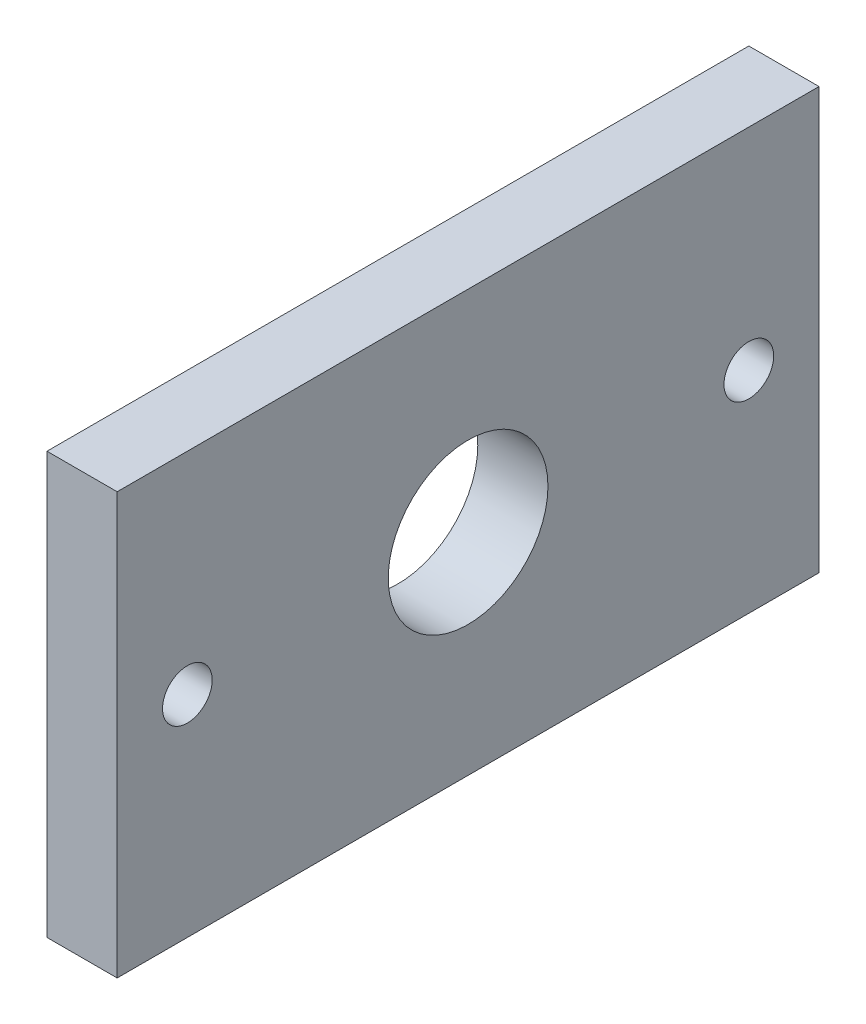
ISO-10303-21;
HEADER;
FILE_DESCRIPTION(('STEP AP214'),'2;1');
FILE_NAME('part.step','',(''),(''),'','','');
FILE_SCHEMA(('AUTOMOTIVE_DESIGN { 1 0 10303 214 1 1 1 1 }'));
ENDSEC;
DATA;
#1=APPLICATION_CONTEXT('core data for automotive mechanical design processes');
#2=APPLICATION_PROTOCOL_DEFINITION('international standard','automotive_design',2000,#1);
#3=PRODUCT_CONTEXT('',#1,'mechanical');
#4=PRODUCT('Part','Part','',(#3));
#5=PRODUCT_RELATED_PRODUCT_CATEGORY('part','',(#4));
#6=PRODUCT_DEFINITION_FORMATION('','',#4);
#7=PRODUCT_DEFINITION_CONTEXT('part definition',#1,'design');
#8=PRODUCT_DEFINITION('design','',#6,#7);
#9=PRODUCT_DEFINITION_SHAPE('','',#8);
#10=(LENGTH_UNIT() NAMED_UNIT(*) SI_UNIT(.MILLI.,.METRE.));
#11=(NAMED_UNIT(*) PLANE_ANGLE_UNIT() SI_UNIT($,.RADIAN.));
#12=(NAMED_UNIT(*) SI_UNIT($,.STERADIAN.) SOLID_ANGLE_UNIT());
#13=UNCERTAINTY_MEASURE_WITH_UNIT(LENGTH_MEASURE(1.E-05),#10,'distance_accuracy_value','');
#14=(GEOMETRIC_REPRESENTATION_CONTEXT(3) GLOBAL_UNCERTAINTY_ASSIGNED_CONTEXT((#13)) GLOBAL_UNIT_ASSIGNED_CONTEXT((#10,
#11,#12)) REPRESENTATION_CONTEXT('',''));
#15=CARTESIAN_POINT('',(0.,0.,0.));
#16=DIRECTION('',(0.,0.,1.));
#17=DIRECTION('',(1.,0.,0.));
#18=AXIS2_PLACEMENT_3D('',#15,#16,#17);
#19=CARTESIAN_POINT('',(6.35,0.,0.));
#20=DIRECTION('',(-1.,0.,0.));
#21=DIRECTION('',(0.,0.,1.));
#22=AXIS2_PLACEMENT_3D('',#19,#20,#21);
#23=PLANE('',#22);
#24=CARTESIAN_POINT('',(6.35,0.,25.4));
#25=DIRECTION('',(1.,0.,0.));
#26=DIRECTION('',(0.,0.,-1.));
#27=AXIS2_PLACEMENT_3D('',#24,#25,#26);
#28=CIRCLE('',#27,2.2479);
#29=CARTESIAN_POINT('',(6.35,0.,23.1521));
#30=VERTEX_POINT('',#29);
#31=EDGE_CURVE('E127',#30,#30,#28,.T.);
#32=ORIENTED_EDGE('',*,*,#31,.F.);
#33=EDGE_LOOP('',(#32));
#34=FACE_BOUND('',#33,.T.);
#35=DIRECTION('',(0.,1.,0.));
#36=VECTOR('',#35,1.);
#37=CARTESIAN_POINT('',(6.35,-19.05,-31.75));
#38=LINE('',#37,#36);
#39=CARTESIAN_POINT('',(6.35,-19.05,-31.75));
#40=VERTEX_POINT('',#39);
#41=CARTESIAN_POINT('',(6.35,19.05,-31.75));
#42=VERTEX_POINT('',#41);
#43=EDGE_CURVE('E97',#40,#42,#38,.T.);
#44=ORIENTED_EDGE('',*,*,#43,.T.);
#45=DIRECTION('',(0.,0.,1.));
#46=VECTOR('',#45,1.);
#47=CARTESIAN_POINT('',(6.35,19.05,31.75));
#48=LINE('',#47,#46);
#49=CARTESIAN_POINT('',(6.35,19.05,31.75));
#50=VERTEX_POINT('',#49);
#51=EDGE_CURVE('E92',#42,#50,#48,.T.);
#52=ORIENTED_EDGE('',*,*,#51,.T.);
#53=DIRECTION('',(0.,-1.,0.));
#54=VECTOR('',#53,1.);
#55=CARTESIAN_POINT('',(6.35,-19.05,31.75));
#56=LINE('',#55,#54);
#57=CARTESIAN_POINT('',(6.35,-19.05,31.75));
#58=VERTEX_POINT('',#57);
#59=EDGE_CURVE('E95',#50,#58,#56,.T.);
#60=ORIENTED_EDGE('',*,*,#59,.T.);
#61=DIRECTION('',(0.,0.,-1.));
#62=VECTOR('',#61,1.);
#63=CARTESIAN_POINT('',(6.35,-19.05,31.75));
#64=LINE('',#63,#62);
#65=EDGE_CURVE('E62',#58,#40,#64,.T.);
#66=ORIENTED_EDGE('',*,*,#65,.T.);
#67=EDGE_LOOP('',(#44,#52,#60,#66));
#68=FACE_BOUND('',#67,.T.);
#69=CARTESIAN_POINT('',(6.35,0.,0.));
#70=DIRECTION('',(1.,0.,0.));
#71=DIRECTION('',(0.,0.,-1.));
#72=AXIS2_PLACEMENT_3D('',#69,#70,#71);
#73=CIRCLE('',#72,7.2263);
#74=CARTESIAN_POINT('',(6.35,0.,-7.2263));
#75=VERTEX_POINT('',#74);
#76=EDGE_CURVE('E112',#75,#75,#73,.T.);
#77=ORIENTED_EDGE('',*,*,#76,.F.);
#78=EDGE_LOOP('',(#77));
#79=FACE_BOUND('',#78,.T.);
#80=CARTESIAN_POINT('',(6.35,0.,-25.4));
#81=DIRECTION('',(1.,0.,0.));
#82=DIRECTION('',(0.,0.,1.));
#83=AXIS2_PLACEMENT_3D('',#80,#81,#82);
#84=CIRCLE('',#83,2.2479);
#85=CARTESIAN_POINT('',(6.35,0.,-23.1521));
#86=VERTEX_POINT('',#85);
#87=EDGE_CURVE('E133',#86,#86,#84,.T.);
#88=ORIENTED_EDGE('',*,*,#87,.F.);
#89=EDGE_LOOP('',(#88));
#90=FACE_BOUND('',#89,.T.);
#91=ADVANCED_FACE('F45',(#34,#68,#79,#90),#23,.F.);
#92=CARTESIAN_POINT('',(0.,0.,0.));
#93=DIRECTION('',(-1.,0.,0.));
#94=DIRECTION('',(0.,0.,1.));
#95=AXIS2_PLACEMENT_3D('',#92,#93,#94);
#96=PLANE('',#95);
#97=CARTESIAN_POINT('',(0.,0.,25.4));
#98=DIRECTION('',(1.,0.,0.));
#99=DIRECTION('',(0.,0.,-1.));
#100=AXIS2_PLACEMENT_3D('',#97,#98,#99);
#101=CIRCLE('',#100,2.2479);
#102=CARTESIAN_POINT('',(0.,0.,23.1521));
#103=VERTEX_POINT('',#102);
#104=EDGE_CURVE('E130',#103,#103,#101,.T.);
#105=ORIENTED_EDGE('',*,*,#104,.T.);
#106=EDGE_LOOP('',(#105));
#107=FACE_BOUND('',#106,.T.);
#108=DIRECTION('',(0.,1.,0.));
#109=VECTOR('',#108,1.);
#110=CARTESIAN_POINT('',(0.,-19.05,-31.75));
#111=LINE('',#110,#109);
#112=CARTESIAN_POINT('',(0.,-19.05,-31.75));
#113=VERTEX_POINT('',#112);
#114=CARTESIAN_POINT('',(0.,19.05,-31.75));
#115=VERTEX_POINT('',#114);
#116=EDGE_CURVE('E109',#113,#115,#111,.T.);
#117=ORIENTED_EDGE('',*,*,#116,.F.);
#118=DIRECTION('',(0.,0.,-1.));
#119=VECTOR('',#118,1.);
#120=CARTESIAN_POINT('',(0.,-19.05,31.75));
#121=LINE('',#120,#119);
#122=CARTESIAN_POINT('',(0.,-19.05,31.75));
#123=VERTEX_POINT('',#122);
#124=EDGE_CURVE('E85',#123,#113,#121,.T.);
#125=ORIENTED_EDGE('',*,*,#124,.F.);
#126=DIRECTION('',(0.,-1.,0.));
#127=VECTOR('',#126,1.);
#128=CARTESIAN_POINT('',(0.,-19.05,31.75));
#129=LINE('',#128,#127);
#130=CARTESIAN_POINT('',(0.,19.05,31.75));
#131=VERTEX_POINT('',#130);
#132=EDGE_CURVE('E79',#131,#123,#129,.T.);
#133=ORIENTED_EDGE('',*,*,#132,.F.);
#134=DIRECTION('',(0.,0.,1.));
#135=VECTOR('',#134,1.);
#136=CARTESIAN_POINT('',(0.,19.05,31.75));
#137=LINE('',#136,#135);
#138=EDGE_CURVE('E101',#115,#131,#137,.T.);
#139=ORIENTED_EDGE('',*,*,#138,.F.);
#140=EDGE_LOOP('',(#117,#125,#133,#139));
#141=FACE_BOUND('',#140,.T.);
#142=CARTESIAN_POINT('',(0.,0.,0.));
#143=DIRECTION('',(1.,0.,0.));
#144=DIRECTION('',(0.,0.,-1.));
#145=AXIS2_PLACEMENT_3D('',#142,#143,#144);
#146=CIRCLE('',#145,7.2263);
#147=CARTESIAN_POINT('',(0.,0.,-7.2263));
#148=VERTEX_POINT('',#147);
#149=EDGE_CURVE('E124',#148,#148,#146,.T.);
#150=ORIENTED_EDGE('',*,*,#149,.T.);
#151=EDGE_LOOP('',(#150));
#152=FACE_BOUND('',#151,.T.);
#153=CARTESIAN_POINT('',(0.,0.,-25.4));
#154=DIRECTION('',(1.,0.,0.));
#155=DIRECTION('',(0.,0.,1.));
#156=AXIS2_PLACEMENT_3D('',#153,#154,#155);
#157=CIRCLE('',#156,2.2479);
#158=CARTESIAN_POINT('',(0.,0.,-23.1521));
#159=VERTEX_POINT('',#158);
#160=EDGE_CURVE('E136',#159,#159,#157,.T.);
#161=ORIENTED_EDGE('',*,*,#160,.T.);
#162=EDGE_LOOP('',(#161));
#163=FACE_BOUND('',#162,.T.);
#164=ADVANCED_FACE('F120',(#107,#141,#152,#163),#96,.T.);
#165=CARTESIAN_POINT('',(6.35,-19.05,-31.75));
#166=DIRECTION('',(0.,0.,1.));
#167=DIRECTION('',(1.,0.,0.));
#168=AXIS2_PLACEMENT_3D('',#165,#166,#167);
#169=PLANE('',#168);
#170=ORIENTED_EDGE('',*,*,#116,.T.);
#171=DIRECTION('',(-1.,0.,0.));
#172=VECTOR('',#171,1.);
#173=CARTESIAN_POINT('',(6.35,19.05,-31.75));
#174=LINE('',#173,#172);
#175=EDGE_CURVE('E13',#42,#115,#174,.T.);
#176=ORIENTED_EDGE('',*,*,#175,.F.);
#177=ORIENTED_EDGE('',*,*,#43,.F.);
#178=DIRECTION('',(-1.,0.,0.));
#179=VECTOR('',#178,1.);
#180=CARTESIAN_POINT('',(6.35,-19.05,-31.75));
#181=LINE('',#180,#179);
#182=EDGE_CURVE('E105',#40,#113,#181,.T.);
#183=ORIENTED_EDGE('',*,*,#182,.T.);
#184=EDGE_LOOP('',(#170,#176,#177,#183));
#185=FACE_BOUND('',#184,.T.);
#186=ADVANCED_FACE('F47',(#185),#169,.F.);
#187=CARTESIAN_POINT('',(6.35,19.05,31.75));
#188=DIRECTION('',(0.,-1.,0.));
#189=DIRECTION('',(0.,0.,-1.));
#190=AXIS2_PLACEMENT_3D('',#187,#188,#189);
#191=PLANE('',#190);
#192=ORIENTED_EDGE('',*,*,#138,.T.);
#193=DIRECTION('',(-1.,0.,0.));
#194=VECTOR('',#193,1.);
#195=CARTESIAN_POINT('',(6.35,19.05,31.75));
#196=LINE('',#195,#194);
#197=EDGE_CURVE('E54',#50,#131,#196,.T.);
#198=ORIENTED_EDGE('',*,*,#197,.F.);
#199=ORIENTED_EDGE('',*,*,#51,.F.);
#200=ORIENTED_EDGE('',*,*,#175,.T.);
#201=EDGE_LOOP('',(#192,#198,#199,#200));
#202=FACE_BOUND('',#201,.T.);
#203=ADVANCED_FACE('F100',(#202),#191,.F.);
#204=CARTESIAN_POINT('',(6.35,-19.05,31.75));
#205=DIRECTION('',(0.,0.,-1.));
#206=DIRECTION('',(-1.,0.,0.));
#207=AXIS2_PLACEMENT_3D('',#204,#205,#206);
#208=PLANE('',#207);
#209=ORIENTED_EDGE('',*,*,#132,.T.);
#210=DIRECTION('',(-1.,0.,0.));
#211=VECTOR('',#210,1.);
#212=CARTESIAN_POINT('',(6.35,-19.05,31.75));
#213=LINE('',#212,#211);
#214=EDGE_CURVE('E102',#58,#123,#213,.T.);
#215=ORIENTED_EDGE('',*,*,#214,.F.);
#216=ORIENTED_EDGE('',*,*,#59,.F.);
#217=ORIENTED_EDGE('',*,*,#197,.T.);
#218=EDGE_LOOP('',(#209,#215,#216,#217));
#219=FACE_BOUND('',#218,.T.);
#220=ADVANCED_FACE('F103',(#219),#208,.F.);
#221=CARTESIAN_POINT('',(6.35,-19.05,31.75));
#222=DIRECTION('',(0.,1.,0.));
#223=DIRECTION('',(0.,0.,1.));
#224=AXIS2_PLACEMENT_3D('',#221,#222,#223);
#225=PLANE('',#224);
#226=ORIENTED_EDGE('',*,*,#124,.T.);
#227=ORIENTED_EDGE('',*,*,#182,.F.);
#228=ORIENTED_EDGE('',*,*,#65,.F.);
#229=ORIENTED_EDGE('',*,*,#214,.T.);
#230=EDGE_LOOP('',(#226,#227,#228,#229));
#231=FACE_BOUND('',#230,.T.);
#232=ADVANCED_FACE('F117',(#231),#225,.F.);
#233=CARTESIAN_POINT('',(6.35,0.,0.));
#234=DIRECTION('',(-1.,0.,0.));
#235=DIRECTION('',(0.,0.,1.));
#236=AXIS2_PLACEMENT_3D('',#233,#234,#235);
#237=CYLINDRICAL_SURFACE('',#236,7.2263);
#238=ORIENTED_EDGE('',*,*,#76,.T.);
#239=EDGE_LOOP('',(#238));
#240=FACE_BOUND('',#239,.T.);
#241=ORIENTED_EDGE('',*,*,#149,.F.);
#242=EDGE_LOOP('',(#241));
#243=FACE_BOUND('',#242,.T.);
#244=ADVANCED_FACE('F155',(#240,#243),#237,.F.);
#245=CARTESIAN_POINT('',(6.35,0.,25.4));
#246=DIRECTION('',(-1.,0.,0.));
#247=DIRECTION('',(0.,0.,1.));
#248=AXIS2_PLACEMENT_3D('',#245,#246,#247);
#249=CYLINDRICAL_SURFACE('',#248,2.2479);
#250=ORIENTED_EDGE('',*,*,#31,.T.);
#251=EDGE_LOOP('',(#250));
#252=FACE_BOUND('',#251,.T.);
#253=ORIENTED_EDGE('',*,*,#104,.F.);
#254=EDGE_LOOP('',(#253));
#255=FACE_BOUND('',#254,.T.);
#256=ADVANCED_FACE('F201',(#252,#255),#249,.F.);
#257=CARTESIAN_POINT('',(6.35,0.,-25.4));
#258=DIRECTION('',(-1.,0.,0.));
#259=DIRECTION('',(0.,0.,1.));
#260=AXIS2_PLACEMENT_3D('',#257,#258,#259);
#261=CYLINDRICAL_SURFACE('',#260,2.2479);
#262=ORIENTED_EDGE('',*,*,#87,.T.);
#263=EDGE_LOOP('',(#262));
#264=FACE_BOUND('',#263,.T.);
#265=ORIENTED_EDGE('',*,*,#160,.F.);
#266=EDGE_LOOP('',(#265));
#267=FACE_BOUND('',#266,.T.);
#268=ADVANCED_FACE('F142',(#264,#267),#261,.F.);
#269=CLOSED_SHELL('',(#91,#164,#186,#203,#220,#232,#244,#256,#268));
#270=MANIFOLD_SOLID_BREP('B2',#269);
#271=ADVANCED_BREP_SHAPE_REPRESENTATION('',(#18,#270),#14);
#272=SHAPE_DEFINITION_REPRESENTATION(#9,#271);
ENDSEC;
END-ISO-10303-21;
